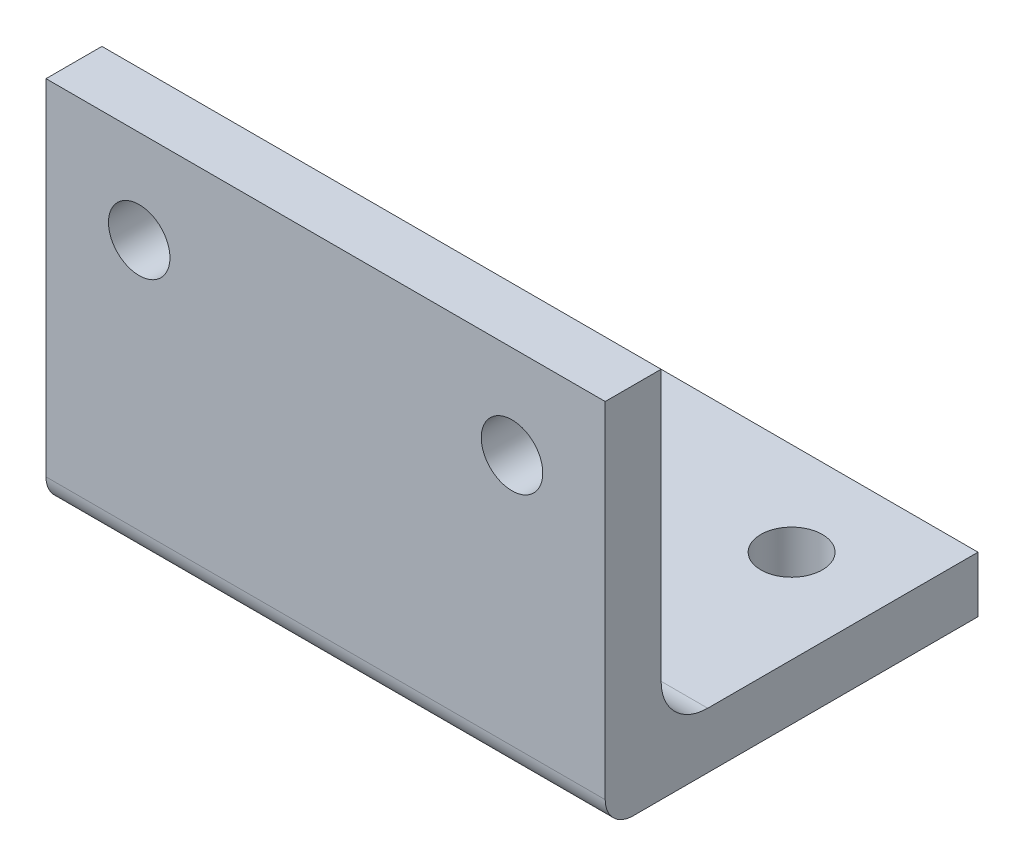
ISO-10303-21;
HEADER;
FILE_DESCRIPTION(('STEP AP214'),'2;1');
FILE_NAME('part.step','',(''),(''),'','','');
FILE_SCHEMA(('AUTOMOTIVE_DESIGN { 1 0 10303 214 1 1 1 1 }'));
ENDSEC;
DATA;
#1=APPLICATION_CONTEXT('core data for automotive mechanical design processes');
#2=APPLICATION_PROTOCOL_DEFINITION('international standard','automotive_design',2000,#1);
#3=PRODUCT_CONTEXT('',#1,'mechanical');
#4=PRODUCT('Part','Part','',(#3));
#5=PRODUCT_RELATED_PRODUCT_CATEGORY('part','',(#4));
#6=PRODUCT_DEFINITION_FORMATION('','',#4);
#7=PRODUCT_DEFINITION_CONTEXT('part definition',#1,'design');
#8=PRODUCT_DEFINITION('design','',#6,#7);
#9=PRODUCT_DEFINITION_SHAPE('','',#8);
#10=(LENGTH_UNIT() NAMED_UNIT(*) SI_UNIT(.MILLI.,.METRE.));
#11=(NAMED_UNIT(*) PLANE_ANGLE_UNIT() SI_UNIT($,.RADIAN.));
#12=(NAMED_UNIT(*) SI_UNIT($,.STERADIAN.) SOLID_ANGLE_UNIT());
#13=UNCERTAINTY_MEASURE_WITH_UNIT(LENGTH_MEASURE(1.E-05),#10,'distance_accuracy_value','');
#14=(GEOMETRIC_REPRESENTATION_CONTEXT(3) GLOBAL_UNCERTAINTY_ASSIGNED_CONTEXT((#13)) GLOBAL_UNIT_ASSIGNED_CONTEXT((#10,
#11,#12)) REPRESENTATION_CONTEXT('',''));
#15=CARTESIAN_POINT('',(0.,0.,0.));
#16=DIRECTION('',(0.,0.,1.));
#17=DIRECTION('',(1.,0.,0.));
#18=AXIS2_PLACEMENT_3D('',#15,#16,#17);
#19=CARTESIAN_POINT('',(60.,40.,0.));
#20=DIRECTION('',(0.,0.,-1.));
#21=DIRECTION('',(-1.,0.,0.));
#22=AXIS2_PLACEMENT_3D('',#19,#20,#21);
#23=PLANE('',#22);
#24=CARTESIAN_POINT('',(10.,30.,0.));
#25=DIRECTION('',(0.,0.,1.));
#26=DIRECTION('',(1.,0.,0.));
#27=AXIS2_PLACEMENT_3D('',#24,#25,#26);
#28=CIRCLE('',#27,3.3);
#29=CARTESIAN_POINT('',(13.3,30.,0.));
#30=VERTEX_POINT('',#29);
#31=EDGE_CURVE('E165',#30,#30,#28,.T.);
#32=ORIENTED_EDGE('',*,*,#31,.F.);
#33=EDGE_LOOP('',(#32));
#34=FACE_BOUND('',#33,.T.);
#35=CARTESIAN_POINT('',(50.,30.,0.));
#36=DIRECTION('',(0.,0.,1.));
#37=DIRECTION('',(1.,0.,0.));
#38=AXIS2_PLACEMENT_3D('',#35,#36,#37);
#39=CIRCLE('',#38,3.3);
#40=CARTESIAN_POINT('',(53.3,30.,0.));
#41=VERTEX_POINT('',#40);
#42=EDGE_CURVE('E204',#41,#41,#39,.T.);
#43=ORIENTED_EDGE('',*,*,#42,.F.);
#44=EDGE_LOOP('',(#43));
#45=FACE_BOUND('',#44,.T.);
#46=DIRECTION('',(0.,-1.,0.));
#47=VECTOR('',#46,1.);
#48=CARTESIAN_POINT('',(0.,40.,0.));
#49=LINE('',#48,#47);
#50=CARTESIAN_POINT('',(0.,40.,0.));
#51=VERTEX_POINT('',#50);
#52=CARTESIAN_POINT('',(0.,3.,0.));
#53=VERTEX_POINT('',#52);
#54=EDGE_CURVE('E136',#51,#53,#49,.T.);
#55=ORIENTED_EDGE('',*,*,#54,.T.);
#56=DIRECTION('',(-1.,0.,0.));
#57=VECTOR('',#56,1.);
#58=CARTESIAN_POINT('',(60.,3.,0.));
#59=LINE('',#58,#57);
#60=CARTESIAN_POINT('',(60.,3.,0.));
#61=VERTEX_POINT('',#60);
#62=EDGE_CURVE('E45',#53,#61,#59,.F.);
#63=ORIENTED_EDGE('',*,*,#62,.T.);
#64=DIRECTION('',(0.,-1.,0.));
#65=VECTOR('',#64,1.);
#66=CARTESIAN_POINT('',(60.,40.,0.));
#67=LINE('',#66,#65);
#68=CARTESIAN_POINT('',(60.,40.,0.));
#69=VERTEX_POINT('',#68);
#70=EDGE_CURVE('E112',#69,#61,#67,.T.);
#71=ORIENTED_EDGE('',*,*,#70,.F.);
#72=DIRECTION('',(-1.,0.,0.));
#73=VECTOR('',#72,1.);
#74=CARTESIAN_POINT('',(60.,40.,0.));
#75=LINE('',#74,#73);
#76=EDGE_CURVE('E135',#69,#51,#75,.T.);
#77=ORIENTED_EDGE('',*,*,#76,.T.);
#78=EDGE_LOOP('',(#55,#63,#71,#77));
#79=FACE_BOUND('',#78,.T.);
#80=ADVANCED_FACE('F37',(#34,#45,#79),#23,.F.);
#81=CARTESIAN_POINT('',(60.,0.,0.));
#82=DIRECTION('',(0.,1.,0.));
#83=DIRECTION('',(0.,0.,1.));
#84=AXIS2_PLACEMENT_3D('',#81,#82,#83);
#85=PLANE('',#84);
#86=CARTESIAN_POINT('',(10.,0.,-30.));
#87=DIRECTION('',(0.,1.,0.));
#88=DIRECTION('',(0.,0.,1.));
#89=AXIS2_PLACEMENT_3D('',#86,#87,#88);
#90=CIRCLE('',#89,3.3);
#91=CARTESIAN_POINT('',(10.,0.,-26.7));
#92=VERTEX_POINT('',#91);
#93=EDGE_CURVE('E158',#92,#92,#90,.T.);
#94=ORIENTED_EDGE('',*,*,#93,.T.);
#95=EDGE_LOOP('',(#94));
#96=FACE_BOUND('',#95,.T.);
#97=CARTESIAN_POINT('',(50.,0.,-30.));
#98=DIRECTION('',(0.,1.,0.));
#99=DIRECTION('',(0.,0.,1.));
#100=AXIS2_PLACEMENT_3D('',#97,#98,#99);
#101=CIRCLE('',#100,3.3);
#102=CARTESIAN_POINT('',(50.,0.,-26.7));
#103=VERTEX_POINT('',#102);
#104=EDGE_CURVE('E168',#103,#103,#101,.T.);
#105=ORIENTED_EDGE('',*,*,#104,.T.);
#106=EDGE_LOOP('',(#105));
#107=FACE_BOUND('',#106,.T.);
#108=DIRECTION('',(0.,0.,-1.));
#109=VECTOR('',#108,1.);
#110=CARTESIAN_POINT('',(60.,0.,0.));
#111=LINE('',#110,#109);
#112=CARTESIAN_POINT('',(60.,0.,-3.));
#113=VERTEX_POINT('',#112);
#114=CARTESIAN_POINT('',(60.,0.,-40.));
#115=VERTEX_POINT('',#114);
#116=EDGE_CURVE('E101',#113,#115,#111,.T.);
#117=ORIENTED_EDGE('',*,*,#116,.F.);
#118=DIRECTION('',(-1.,0.,0.));
#119=VECTOR('',#118,1.);
#120=CARTESIAN_POINT('',(60.,0.,-3.));
#121=LINE('',#120,#119);
#122=CARTESIAN_POINT('',(0.,0.,-3.));
#123=VERTEX_POINT('',#122);
#124=EDGE_CURVE('E177',#113,#123,#121,.T.);
#125=ORIENTED_EDGE('',*,*,#124,.T.);
#126=DIRECTION('',(0.,0.,-1.));
#127=VECTOR('',#126,1.);
#128=CARTESIAN_POINT('',(0.,0.,0.));
#129=LINE('',#128,#127);
#130=CARTESIAN_POINT('',(0.,0.,-40.));
#131=VERTEX_POINT('',#130);
#132=EDGE_CURVE('E117',#123,#131,#129,.T.);
#133=ORIENTED_EDGE('',*,*,#132,.T.);
#134=DIRECTION('',(-1.,0.,0.));
#135=VECTOR('',#134,1.);
#136=CARTESIAN_POINT('',(60.,0.,-40.));
#137=LINE('',#136,#135);
#138=EDGE_CURVE('E115',#115,#131,#137,.T.);
#139=ORIENTED_EDGE('',*,*,#138,.F.);
#140=EDGE_LOOP('',(#117,#125,#133,#139));
#141=FACE_BOUND('',#140,.T.);
#142=ADVANCED_FACE('F116',(#96,#107,#141),#85,.F.);
#143=CARTESIAN_POINT('',(60.,0.,-40.));
#144=DIRECTION('',(0.,0.,1.));
#145=DIRECTION('',(1.,0.,0.));
#146=AXIS2_PLACEMENT_3D('',#143,#144,#145);
#147=PLANE('',#146);
#148=DIRECTION('',(0.,1.,0.));
#149=VECTOR('',#148,1.);
#150=CARTESIAN_POINT('',(0.,0.,-40.));
#151=LINE('',#150,#149);
#152=CARTESIAN_POINT('',(0.,6.,-40.));
#153=VERTEX_POINT('',#152);
#154=EDGE_CURVE('E140',#131,#153,#151,.T.);
#155=ORIENTED_EDGE('',*,*,#154,.T.);
#156=DIRECTION('',(-1.,0.,0.));
#157=VECTOR('',#156,1.);
#158=CARTESIAN_POINT('',(60.,6.,-40.));
#159=LINE('',#158,#157);
#160=CARTESIAN_POINT('',(60.,6.,-40.));
#161=VERTEX_POINT('',#160);
#162=EDGE_CURVE('E121',#161,#153,#159,.T.);
#163=ORIENTED_EDGE('',*,*,#162,.F.);
#164=DIRECTION('',(0.,1.,0.));
#165=VECTOR('',#164,1.);
#166=CARTESIAN_POINT('',(60.,0.,-40.));
#167=LINE('',#166,#165);
#168=EDGE_CURVE('E106',#115,#161,#167,.T.);
#169=ORIENTED_EDGE('',*,*,#168,.F.);
#170=ORIENTED_EDGE('',*,*,#138,.T.);
#171=EDGE_LOOP('',(#155,#163,#169,#170));
#172=FACE_BOUND('',#171,.T.);
#173=ADVANCED_FACE('F123',(#172),#147,.F.);
#174=CARTESIAN_POINT('',(60.,6.,-40.));
#175=DIRECTION('',(0.,-1.,0.));
#176=DIRECTION('',(0.,0.,-1.));
#177=AXIS2_PLACEMENT_3D('',#174,#175,#176);
#178=PLANE('',#177);
#179=CARTESIAN_POINT('',(10.,6.,-30.));
#180=DIRECTION('',(0.,-1.,0.));
#181=DIRECTION('',(0.,0.,-1.));
#182=AXIS2_PLACEMENT_3D('',#179,#180,#181);
#183=CIRCLE('',#182,3.3);
#184=CARTESIAN_POINT('',(10.,6.,-33.3));
#185=VERTEX_POINT('',#184);
#186=EDGE_CURVE('E138',#185,#185,#183,.F.);
#187=ORIENTED_EDGE('',*,*,#186,.F.);
#188=EDGE_LOOP('',(#187));
#189=FACE_BOUND('',#188,.T.);
#190=CARTESIAN_POINT('',(50.,6.,-30.));
#191=DIRECTION('',(0.,-1.,0.));
#192=DIRECTION('',(0.,0.,-1.));
#193=AXIS2_PLACEMENT_3D('',#190,#191,#192);
#194=CIRCLE('',#193,3.3);
#195=CARTESIAN_POINT('',(50.,6.,-33.3));
#196=VERTEX_POINT('',#195);
#197=EDGE_CURVE('E155',#196,#196,#194,.F.);
#198=ORIENTED_EDGE('',*,*,#197,.F.);
#199=EDGE_LOOP('',(#198));
#200=FACE_BOUND('',#199,.T.);
#201=DIRECTION('',(0.,0.,1.));
#202=VECTOR('',#201,1.);
#203=CARTESIAN_POINT('',(0.,6.,-40.));
#204=LINE('',#203,#202);
#205=CARTESIAN_POINT('',(0.,6.,-11.));
#206=VERTEX_POINT('',#205);
#207=EDGE_CURVE('E142',#153,#206,#204,.T.);
#208=ORIENTED_EDGE('',*,*,#207,.T.);
#209=DIRECTION('',(-1.,0.,0.));
#210=VECTOR('',#209,1.);
#211=CARTESIAN_POINT('',(60.,6.,-11.));
#212=LINE('',#211,#210);
#213=CARTESIAN_POINT('',(60.,6.,-11.));
#214=VERTEX_POINT('',#213);
#215=EDGE_CURVE('E171',#206,#214,#212,.F.);
#216=ORIENTED_EDGE('',*,*,#215,.T.);
#217=DIRECTION('',(0.,0.,1.));
#218=VECTOR('',#217,1.);
#219=CARTESIAN_POINT('',(60.,6.,-40.));
#220=LINE('',#219,#218);
#221=EDGE_CURVE('E126',#161,#214,#220,.T.);
#222=ORIENTED_EDGE('',*,*,#221,.F.);
#223=ORIENTED_EDGE('',*,*,#162,.T.);
#224=EDGE_LOOP('',(#208,#216,#222,#223));
#225=FACE_BOUND('',#224,.T.);
#226=ADVANCED_FACE('F183',(#189,#200,#225),#178,.F.);
#227=CARTESIAN_POINT('',(60.,6.,-6.));
#228=DIRECTION('',(0.,0.,1.));
#229=DIRECTION('',(1.,0.,0.));
#230=AXIS2_PLACEMENT_3D('',#227,#228,#229);
#231=PLANE('',#230);
#232=CARTESIAN_POINT('',(10.,30.,-6.));
#233=DIRECTION('',(0.,0.,1.));
#234=DIRECTION('',(1.,0.,0.));
#235=AXIS2_PLACEMENT_3D('',#232,#233,#234);
#236=CIRCLE('',#235,3.3);
#237=CARTESIAN_POINT('',(13.3,30.,-6.));
#238=VERTEX_POINT('',#237);
#239=EDGE_CURVE('E164',#238,#238,#236,.T.);
#240=ORIENTED_EDGE('',*,*,#239,.T.);
#241=EDGE_LOOP('',(#240));
#242=FACE_BOUND('',#241,.T.);
#243=CARTESIAN_POINT('',(50.,30.,-6.));
#244=DIRECTION('',(0.,0.,1.));
#245=DIRECTION('',(1.,0.,0.));
#246=AXIS2_PLACEMENT_3D('',#243,#244,#245);
#247=CIRCLE('',#246,3.3);
#248=CARTESIAN_POINT('',(53.3,30.,-6.));
#249=VERTEX_POINT('',#248);
#250=EDGE_CURVE('E161',#249,#249,#247,.T.);
#251=ORIENTED_EDGE('',*,*,#250,.T.);
#252=EDGE_LOOP('',(#251));
#253=FACE_BOUND('',#252,.T.);
#254=DIRECTION('',(0.,1.,0.));
#255=VECTOR('',#254,1.);
#256=CARTESIAN_POINT('',(60.,6.,-6.));
#257=LINE('',#256,#255);
#258=CARTESIAN_POINT('',(60.,11.,-6.));
#259=VERTEX_POINT('',#258);
#260=CARTESIAN_POINT('',(60.,40.,-6.));
#261=VERTEX_POINT('',#260);
#262=EDGE_CURVE('E128',#259,#261,#257,.T.);
#263=ORIENTED_EDGE('',*,*,#262,.F.);
#264=DIRECTION('',(-1.,0.,0.));
#265=VECTOR('',#264,1.);
#266=CARTESIAN_POINT('',(0.,11.,-6.));
#267=LINE('',#266,#265);
#268=CARTESIAN_POINT('',(0.,11.,-6.));
#269=VERTEX_POINT('',#268);
#270=EDGE_CURVE('E120',#259,#269,#267,.T.);
#271=ORIENTED_EDGE('',*,*,#270,.T.);
#272=DIRECTION('',(0.,1.,0.));
#273=VECTOR('',#272,1.);
#274=CARTESIAN_POINT('',(0.,6.,-6.));
#275=LINE('',#274,#273);
#276=CARTESIAN_POINT('',(0.,40.,-6.));
#277=VERTEX_POINT('',#276);
#278=EDGE_CURVE('E145',#269,#277,#275,.T.);
#279=ORIENTED_EDGE('',*,*,#278,.T.);
#280=DIRECTION('',(-1.,0.,0.));
#281=VECTOR('',#280,1.);
#282=CARTESIAN_POINT('',(60.,40.,-6.));
#283=LINE('',#282,#281);
#284=EDGE_CURVE('E151',#261,#277,#283,.T.);
#285=ORIENTED_EDGE('',*,*,#284,.F.);
#286=EDGE_LOOP('',(#263,#271,#279,#285));
#287=FACE_BOUND('',#286,.T.);
#288=ADVANCED_FACE('F192',(#242,#253,#287),#231,.F.);
#289=CARTESIAN_POINT('',(60.,40.,-6.));
#290=DIRECTION('',(0.,-1.,0.));
#291=DIRECTION('',(0.,0.,-1.));
#292=AXIS2_PLACEMENT_3D('',#289,#290,#291);
#293=PLANE('',#292);
#294=DIRECTION('',(0.,0.,1.));
#295=VECTOR('',#294,1.);
#296=CARTESIAN_POINT('',(0.,40.,-6.));
#297=LINE('',#296,#295);
#298=EDGE_CURVE('E147',#277,#51,#297,.T.);
#299=ORIENTED_EDGE('',*,*,#298,.T.);
#300=ORIENTED_EDGE('',*,*,#76,.F.);
#301=DIRECTION('',(0.,0.,1.));
#302=VECTOR('',#301,1.);
#303=CARTESIAN_POINT('',(60.,40.,-6.));
#304=LINE('',#303,#302);
#305=EDGE_CURVE('E133',#261,#69,#304,.T.);
#306=ORIENTED_EDGE('',*,*,#305,.F.);
#307=ORIENTED_EDGE('',*,*,#284,.T.);
#308=EDGE_LOOP('',(#299,#300,#306,#307));
#309=FACE_BOUND('',#308,.T.);
#310=ADVANCED_FACE('F197',(#309),#293,.F.);
#311=CARTESIAN_POINT('',(60.,0.,0.));
#312=DIRECTION('',(1.,0.,0.));
#313=DIRECTION('',(0.,0.,-1.));
#314=AXIS2_PLACEMENT_3D('',#311,#312,#313);
#315=PLANE('',#314);
#316=ORIENTED_EDGE('',*,*,#70,.T.);
#317=CARTESIAN_POINT('',(60.,3.,-3.));
#318=DIRECTION('',(1.,0.,0.));
#319=DIRECTION('',(0.,0.,-1.));
#320=AXIS2_PLACEMENT_3D('',#317,#318,#319);
#321=CIRCLE('',#320,3.);
#322=EDGE_CURVE('E11',#61,#113,#321,.T.);
#323=ORIENTED_EDGE('',*,*,#322,.T.);
#324=ORIENTED_EDGE('',*,*,#116,.T.);
#325=ORIENTED_EDGE('',*,*,#168,.T.);
#326=ORIENTED_EDGE('',*,*,#221,.T.);
#327=CARTESIAN_POINT('',(60.,11.,-11.));
#328=DIRECTION('',(1.,0.,0.));
#329=DIRECTION('',(0.,0.,-1.));
#330=AXIS2_PLACEMENT_3D('',#327,#328,#329);
#331=CIRCLE('',#330,5.);
#332=EDGE_CURVE('E175',#214,#259,#331,.F.);
#333=ORIENTED_EDGE('',*,*,#332,.T.);
#334=ORIENTED_EDGE('',*,*,#262,.T.);
#335=ORIENTED_EDGE('',*,*,#305,.T.);
#336=EDGE_LOOP('',(#316,#323,#324,#325,#326,#333,#334,#335));
#337=FACE_BOUND('',#336,.T.);
#338=ADVANCED_FACE('F103',(#337),#315,.T.);
#339=CARTESIAN_POINT('',(0.,0.,0.));
#340=DIRECTION('',(1.,0.,0.));
#341=DIRECTION('',(0.,0.,-1.));
#342=AXIS2_PLACEMENT_3D('',#339,#340,#341);
#343=PLANE('',#342);
#344=ORIENTED_EDGE('',*,*,#132,.F.);
#345=CARTESIAN_POINT('',(0.,3.,-3.));
#346=DIRECTION('',(1.,0.,0.));
#347=DIRECTION('',(0.,0.,-1.));
#348=AXIS2_PLACEMENT_3D('',#345,#346,#347);
#349=CIRCLE('',#348,3.);
#350=EDGE_CURVE('E59',#123,#53,#349,.F.);
#351=ORIENTED_EDGE('',*,*,#350,.T.);
#352=ORIENTED_EDGE('',*,*,#54,.F.);
#353=ORIENTED_EDGE('',*,*,#298,.F.);
#354=ORIENTED_EDGE('',*,*,#278,.F.);
#355=CARTESIAN_POINT('',(0.,11.,-11.));
#356=DIRECTION('',(1.,0.,0.));
#357=DIRECTION('',(0.,0.,-1.));
#358=AXIS2_PLACEMENT_3D('',#355,#356,#357);
#359=CIRCLE('',#358,5.);
#360=EDGE_CURVE('E173',#269,#206,#359,.T.);
#361=ORIENTED_EDGE('',*,*,#360,.T.);
#362=ORIENTED_EDGE('',*,*,#207,.F.);
#363=ORIENTED_EDGE('',*,*,#154,.F.);
#364=EDGE_LOOP('',(#344,#351,#352,#353,#354,#361,#362,#363));
#365=FACE_BOUND('',#364,.T.);
#366=ADVANCED_FACE('F180',(#365),#343,.F.);
#367=CARTESIAN_POINT('',(50.,40.,-30.));
#368=DIRECTION('',(0.,-1.,0.));
#369=DIRECTION('',(0.,0.,-1.));
#370=AXIS2_PLACEMENT_3D('',#367,#368,#369);
#371=CYLINDRICAL_SURFACE('',#370,3.3);
#372=ORIENTED_EDGE('',*,*,#104,.F.);
#373=EDGE_LOOP('',(#372));
#374=FACE_BOUND('',#373,.T.);
#375=ORIENTED_EDGE('',*,*,#197,.T.);
#376=EDGE_LOOP('',(#375));
#377=FACE_BOUND('',#376,.T.);
#378=ADVANCED_FACE('F252',(#374,#377),#371,.F.);
#379=CARTESIAN_POINT('',(10.,40.,-30.));
#380=DIRECTION('',(0.,-1.,0.));
#381=DIRECTION('',(0.,0.,-1.));
#382=AXIS2_PLACEMENT_3D('',#379,#380,#381);
#383=CYLINDRICAL_SURFACE('',#382,3.3);
#384=ORIENTED_EDGE('',*,*,#93,.F.);
#385=EDGE_LOOP('',(#384));
#386=FACE_BOUND('',#385,.T.);
#387=ORIENTED_EDGE('',*,*,#186,.T.);
#388=EDGE_LOOP('',(#387));
#389=FACE_BOUND('',#388,.T.);
#390=ADVANCED_FACE('F221',(#386,#389),#383,.F.);
#391=CARTESIAN_POINT('',(50.,30.,-40.));
#392=DIRECTION('',(0.,0.,1.));
#393=DIRECTION('',(1.,0.,0.));
#394=AXIS2_PLACEMENT_3D('',#391,#392,#393);
#395=CYLINDRICAL_SURFACE('',#394,3.3);
#396=ORIENTED_EDGE('',*,*,#42,.T.);
#397=EDGE_LOOP('',(#396));
#398=FACE_BOUND('',#397,.T.);
#399=ORIENTED_EDGE('',*,*,#250,.F.);
#400=EDGE_LOOP('',(#399));
#401=FACE_BOUND('',#400,.T.);
#402=ADVANCED_FACE('F218',(#398,#401),#395,.F.);
#403=CARTESIAN_POINT('',(10.,30.,-40.));
#404=DIRECTION('',(0.,0.,1.));
#405=DIRECTION('',(1.,0.,0.));
#406=AXIS2_PLACEMENT_3D('',#403,#404,#405);
#407=CYLINDRICAL_SURFACE('',#406,3.3);
#408=ORIENTED_EDGE('',*,*,#31,.T.);
#409=EDGE_LOOP('',(#408));
#410=FACE_BOUND('',#409,.T.);
#411=ORIENTED_EDGE('',*,*,#239,.F.);
#412=EDGE_LOOP('',(#411));
#413=FACE_BOUND('',#412,.T.);
#414=ADVANCED_FACE('F210',(#410,#413),#407,.F.);
#415=CARTESIAN_POINT('',(60.,11.,-11.));
#416=DIRECTION('',(1.,0.,0.));
#417=DIRECTION('',(0.,0.,-1.));
#418=AXIS2_PLACEMENT_3D('',#415,#416,#417);
#419=CYLINDRICAL_SURFACE('',#418,5.);
#420=ORIENTED_EDGE('',*,*,#332,.F.);
#421=ORIENTED_EDGE('',*,*,#215,.F.);
#422=ORIENTED_EDGE('',*,*,#360,.F.);
#423=ORIENTED_EDGE('',*,*,#270,.F.);
#424=EDGE_LOOP('',(#420,#421,#422,#423));
#425=FACE_BOUND('',#424,.T.);
#426=ADVANCED_FACE('F189',(#425),#419,.F.);
#427=CARTESIAN_POINT('',(60.,3.,-3.));
#428=DIRECTION('',(-1.,0.,0.));
#429=DIRECTION('',(0.,0.,1.));
#430=AXIS2_PLACEMENT_3D('',#427,#428,#429);
#431=CYLINDRICAL_SURFACE('',#430,3.);
#432=ORIENTED_EDGE('',*,*,#322,.F.);
#433=ORIENTED_EDGE('',*,*,#62,.F.);
#434=ORIENTED_EDGE('',*,*,#350,.F.);
#435=ORIENTED_EDGE('',*,*,#124,.F.);
#436=EDGE_LOOP('',(#432,#433,#434,#435));
#437=FACE_BOUND('',#436,.T.);
#438=ADVANCED_FACE('F39',(#437),#431,.T.);
#439=CLOSED_SHELL('',(#80,#142,#173,#226,#288,#310,#338,#366,#378,#390,#402,#414,#426,#438));
#440=MANIFOLD_SOLID_BREP('B2',#439);
#441=ADVANCED_BREP_SHAPE_REPRESENTATION('',(#18,#440),#14);
#442=SHAPE_DEFINITION_REPRESENTATION(#9,#441);
ENDSEC;
END-ISO-10303-21;
